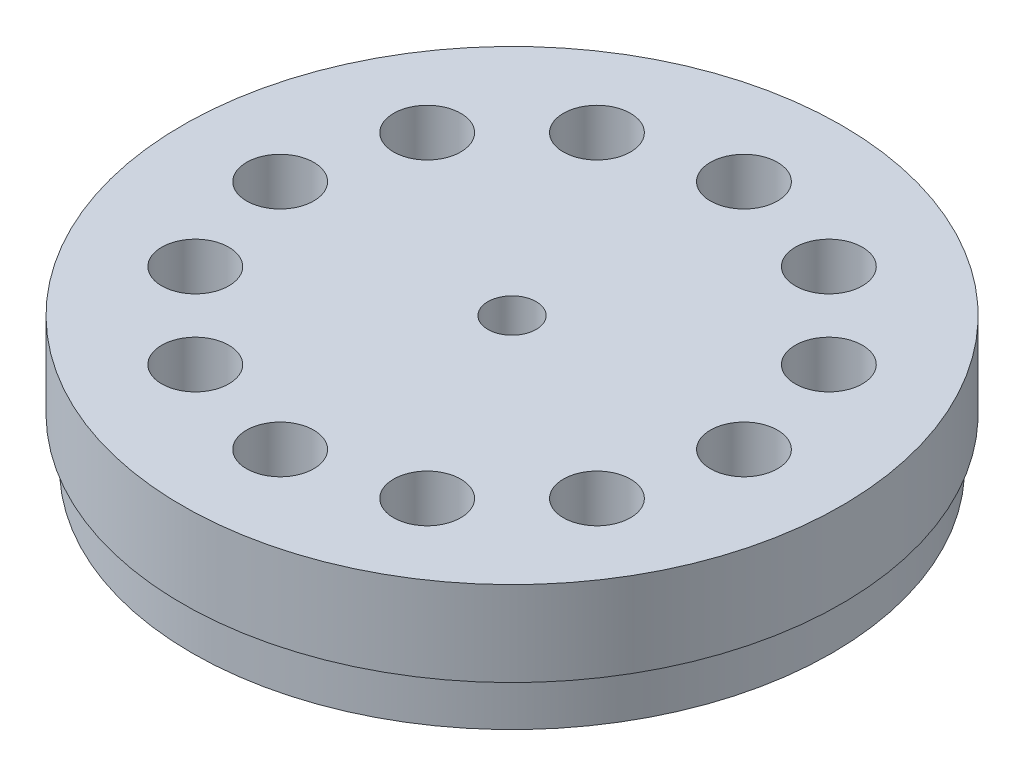
ISO-10303-21;
HEADER;
FILE_DESCRIPTION(('STEP AP214'),'2;1');
FILE_NAME('part.step','',(''),(''),'','','');
FILE_SCHEMA(('AUTOMOTIVE_DESIGN { 1 0 10303 214 1 1 1 1 }'));
ENDSEC;
DATA;
#1=APPLICATION_CONTEXT('core data for automotive mechanical design processes');
#2=APPLICATION_PROTOCOL_DEFINITION('international standard','automotive_design',2000,#1);
#3=PRODUCT_CONTEXT('',#1,'mechanical');
#4=PRODUCT('Part','Part','',(#3));
#5=PRODUCT_RELATED_PRODUCT_CATEGORY('part','',(#4));
#6=PRODUCT_DEFINITION_FORMATION('','',#4);
#7=PRODUCT_DEFINITION_CONTEXT('part definition',#1,'design');
#8=PRODUCT_DEFINITION('design','',#6,#7);
#9=PRODUCT_DEFINITION_SHAPE('','',#8);
#10=(LENGTH_UNIT() NAMED_UNIT(*) SI_UNIT(.MILLI.,.METRE.));
#11=(NAMED_UNIT(*) PLANE_ANGLE_UNIT() SI_UNIT($,.RADIAN.));
#12=(NAMED_UNIT(*) SI_UNIT($,.STERADIAN.) SOLID_ANGLE_UNIT());
#13=UNCERTAINTY_MEASURE_WITH_UNIT(LENGTH_MEASURE(1.E-05),#10,'distance_accuracy_value','');
#14=(GEOMETRIC_REPRESENTATION_CONTEXT(3) GLOBAL_UNCERTAINTY_ASSIGNED_CONTEXT((#13)) GLOBAL_UNIT_ASSIGNED_CONTEXT((#10,
#11,#12)) REPRESENTATION_CONTEXT('',''));
#15=CARTESIAN_POINT('',(0.,0.,0.));
#16=DIRECTION('',(0.,0.,1.));
#17=DIRECTION('',(1.,0.,0.));
#18=AXIS2_PLACEMENT_3D('',#15,#16,#17);
#19=CARTESIAN_POINT('',(0.,0.,0.));
#20=DIRECTION('',(0.,-1.,0.));
#21=DIRECTION('',(0.,0.,-1.));
#22=AXIS2_PLACEMENT_3D('',#19,#20,#21);
#23=PLANE('',#22);
#24=CARTESIAN_POINT('',(0.,0.,0.));
#25=DIRECTION('',(0.,-1.,0.));
#26=DIRECTION('',(0.,0.,-1.));
#27=AXIS2_PLACEMENT_3D('',#24,#25,#26);
#28=CIRCLE('',#27,2.24789999999999);
#29=CARTESIAN_POINT('',(0.,0.,-2.24789999999999));
#30=VERTEX_POINT('',#29);
#31=EDGE_CURVE('E224',#30,#30,#28,.T.);
#32=ORIENTED_EDGE('',*,*,#31,.T.);
#33=EDGE_LOOP('',(#32));
#34=FACE_BOUND('',#33,.T.);
#35=CARTESIAN_POINT('',(-10.7949999999998,0.,-18.6974884677062));
#36=DIRECTION('',(0.,1.,0.));
#37=DIRECTION('',(0.,0.,1.));
#38=AXIS2_PLACEMENT_3D('',#35,#36,#37);
#39=CIRCLE('',#38,3.1242);
#40=CARTESIAN_POINT('',(-10.7949999999998,0.,-15.5732884677062));
#41=VERTEX_POINT('',#40);
#42=EDGE_CURVE('E103',#41,#41,#39,.T.);
#43=ORIENTED_EDGE('',*,*,#42,.F.);
#44=EDGE_LOOP('',(#43));
#45=FACE_BOUND('',#44,.T.);
#46=CARTESIAN_POINT('',(-18.6974884677059,0.,-10.7950000000002));
#47=DIRECTION('',(0.,1.,0.));
#48=DIRECTION('',(0.,0.,1.));
#49=AXIS2_PLACEMENT_3D('',#46,#47,#48);
#50=CIRCLE('',#49,3.1242);
#51=CARTESIAN_POINT('',(-18.6974884677059,0.,-7.67080000000022));
#52=VERTEX_POINT('',#51);
#53=EDGE_CURVE('E93',#52,#52,#50,.T.);
#54=ORIENTED_EDGE('',*,*,#53,.F.);
#55=EDGE_LOOP('',(#54));
#56=FACE_BOUND('',#55,.T.);
#57=CARTESIAN_POINT('',(-21.59,0.,-2.26143377299055E-13));
#58=DIRECTION('',(0.,1.,0.));
#59=DIRECTION('',(0.,0.,1.));
#60=AXIS2_PLACEMENT_3D('',#57,#58,#59);
#61=CIRCLE('',#60,3.1242);
#62=CARTESIAN_POINT('',(-21.59,0.,3.12419999999977));
#63=VERTEX_POINT('',#62);
#64=EDGE_CURVE('E90',#63,#63,#61,.T.);
#65=ORIENTED_EDGE('',*,*,#64,.F.);
#66=EDGE_LOOP('',(#65));
#67=FACE_BOUND('',#66,.T.);
#68=CARTESIAN_POINT('',(-18.6974884677061,0.,10.7949999999998));
#69=DIRECTION('',(0.,1.,0.));
#70=DIRECTION('',(0.,0.,1.));
#71=AXIS2_PLACEMENT_3D('',#68,#69,#70);
#72=CIRCLE('',#71,3.1242);
#73=CARTESIAN_POINT('',(-18.6974884677061,0.,13.9191999999998));
#74=VERTEX_POINT('',#73);
#75=EDGE_CURVE('E87',#74,#74,#72,.T.);
#76=ORIENTED_EDGE('',*,*,#75,.F.);
#77=EDGE_LOOP('',(#76));
#78=FACE_BOUND('',#77,.T.);
#79=CARTESIAN_POINT('',(-10.7950000000002,0.,18.6974884677059));
#80=DIRECTION('',(0.,1.,0.));
#81=DIRECTION('',(0.,0.,1.));
#82=AXIS2_PLACEMENT_3D('',#79,#80,#81);
#83=CIRCLE('',#82,3.1242);
#84=CARTESIAN_POINT('',(-10.7950000000002,0.,21.8216884677059));
#85=VERTEX_POINT('',#84);
#86=EDGE_CURVE('E83',#85,#85,#83,.T.);
#87=ORIENTED_EDGE('',*,*,#86,.F.);
#88=EDGE_LOOP('',(#87));
#89=FACE_BOUND('',#88,.T.);
#90=CARTESIAN_POINT('',(-1.50762251532703E-13,0.,21.59));
#91=DIRECTION('',(0.,1.,0.));
#92=DIRECTION('',(0.,0.,1.));
#93=AXIS2_PLACEMENT_3D('',#90,#91,#92);
#94=CIRCLE('',#93,3.1242);
#95=CARTESIAN_POINT('',(-1.50762251532703E-13,0.,24.7142));
#96=VERTEX_POINT('',#95);
#97=EDGE_CURVE('E79',#96,#96,#94,.T.);
#98=ORIENTED_EDGE('',*,*,#97,.F.);
#99=EDGE_LOOP('',(#98));
#100=FACE_BOUND('',#99,.T.);
#101=CARTESIAN_POINT('',(10.7949999999999,0.,18.6974884677061));
#102=DIRECTION('',(0.,1.,0.));
#103=DIRECTION('',(0.,0.,1.));
#104=AXIS2_PLACEMENT_3D('',#101,#102,#103);
#105=CIRCLE('',#104,3.1242);
#106=CARTESIAN_POINT('',(10.7949999999999,0.,21.8216884677061));
#107=VERTEX_POINT('',#106);
#108=EDGE_CURVE('E75',#107,#107,#105,.T.);
#109=ORIENTED_EDGE('',*,*,#108,.F.);
#110=EDGE_LOOP('',(#109));
#111=FACE_BOUND('',#110,.T.);
#112=CARTESIAN_POINT('',(18.697488467706,0.,10.7950000000001));
#113=DIRECTION('',(0.,1.,0.));
#114=DIRECTION('',(0.,0.,1.));
#115=AXIS2_PLACEMENT_3D('',#112,#113,#114);
#116=CIRCLE('',#115,3.1242);
#117=CARTESIAN_POINT('',(18.697488467706,0.,13.9192000000001));
#118=VERTEX_POINT('',#117);
#119=EDGE_CURVE('E71',#118,#118,#116,.T.);
#120=ORIENTED_EDGE('',*,*,#119,.F.);
#121=EDGE_LOOP('',(#120));
#122=FACE_BOUND('',#121,.T.);
#123=CARTESIAN_POINT('',(21.59,0.,0.));
#124=DIRECTION('',(0.,1.,0.));
#125=DIRECTION('',(0.,0.,1.));
#126=AXIS2_PLACEMENT_3D('',#123,#124,#125);
#127=CIRCLE('',#126,3.1242);
#128=CARTESIAN_POINT('',(21.59,0.,3.12420000000007));
#129=VERTEX_POINT('',#128);
#130=EDGE_CURVE('E67',#129,#129,#127,.T.);
#131=ORIENTED_EDGE('',*,*,#130,.F.);
#132=EDGE_LOOP('',(#131));
#133=FACE_BOUND('',#132,.T.);
#134=CARTESIAN_POINT('',(18.6974884677061,0.,-10.795));
#135=DIRECTION('',(0.,1.,0.));
#136=DIRECTION('',(0.,0.,1.));
#137=AXIS2_PLACEMENT_3D('',#134,#135,#136);
#138=CIRCLE('',#137,3.1242);
#139=CARTESIAN_POINT('',(18.6974884677061,0.,-7.67079999999996));
#140=VERTEX_POINT('',#139);
#141=EDGE_CURVE('E63',#140,#140,#138,.T.);
#142=ORIENTED_EDGE('',*,*,#141,.F.);
#143=EDGE_LOOP('',(#142));
#144=FACE_BOUND('',#143,.T.);
#145=CARTESIAN_POINT('',(10.795,0.,-18.697488467706));
#146=DIRECTION('',(0.,1.,0.));
#147=DIRECTION('',(0.,0.,1.));
#148=AXIS2_PLACEMENT_3D('',#145,#146,#147);
#149=CIRCLE('',#148,3.1242);
#150=CARTESIAN_POINT('',(10.795,0.,-15.573288467706));
#151=VERTEX_POINT('',#150);
#152=EDGE_CURVE('E59',#151,#151,#149,.T.);
#153=ORIENTED_EDGE('',*,*,#152,.F.);
#154=EDGE_LOOP('',(#153));
#155=FACE_BOUND('',#154,.T.);
#156=CARTESIAN_POINT('',(0.,0.,-21.59));
#157=DIRECTION('',(0.,1.,0.));
#158=DIRECTION('',(0.,0.,1.));
#159=AXIS2_PLACEMENT_3D('',#156,#157,#158);
#160=CIRCLE('',#159,3.1242);
#161=CARTESIAN_POINT('',(0.,0.,-18.4658));
#162=VERTEX_POINT('',#161);
#163=EDGE_CURVE('E55',#162,#162,#160,.T.);
#164=ORIENTED_EDGE('',*,*,#163,.F.);
#165=EDGE_LOOP('',(#164));
#166=FACE_BOUND('',#165,.T.);
#167=CARTESIAN_POINT('',(0.,0.,0.));
#168=DIRECTION('',(0.,-1.,0.));
#169=DIRECTION('',(0.,0.,-1.));
#170=AXIS2_PLACEMENT_3D('',#167,#168,#169);
#171=CIRCLE('',#170,30.6832);
#172=CARTESIAN_POINT('',(0.,0.,-30.6832));
#173=VERTEX_POINT('',#172);
#174=EDGE_CURVE('E10',#173,#173,#171,.T.);
#175=ORIENTED_EDGE('',*,*,#174,.F.);
#176=EDGE_LOOP('',(#175));
#177=FACE_BOUND('',#176,.T.);
#178=ADVANCED_FACE('F35',(#34,#45,#56,#67,#78,#89,#100,#111,#122,#133,#144,#155,#166,#177),#23,.F.);
#179=CARTESIAN_POINT('',(0.,-6.223,0.));
#180=DIRECTION('',(0.,-1.,0.));
#181=DIRECTION('',(0.,0.,-1.));
#182=AXIS2_PLACEMENT_3D('',#179,#180,#181);
#183=CYLINDRICAL_SURFACE('',#182,30.6832);
#184=CARTESIAN_POINT('',(0.,-7.8994,0.));
#185=DIRECTION('',(0.,-1.,0.));
#186=DIRECTION('',(0.,0.,-1.));
#187=AXIS2_PLACEMENT_3D('',#184,#185,#186);
#188=CIRCLE('',#187,30.6832);
#189=CARTESIAN_POINT('',(0.,-7.8994,-30.6832));
#190=VERTEX_POINT('',#189);
#191=EDGE_CURVE('E42',#190,#190,#188,.T.);
#192=ORIENTED_EDGE('',*,*,#191,.F.);
#193=EDGE_LOOP('',(#192));
#194=FACE_BOUND('',#193,.T.);
#195=ORIENTED_EDGE('',*,*,#174,.T.);
#196=EDGE_LOOP('',(#195));
#197=FACE_BOUND('',#196,.T.);
#198=ADVANCED_FACE('F140',(#194,#197),#183,.T.);
#199=CARTESIAN_POINT('',(-30.6832,-7.8994,0.));
#200=DIRECTION('',(0.,1.,0.));
#201=DIRECTION('',(0.,0.,1.));
#202=AXIS2_PLACEMENT_3D('',#199,#200,#201);
#203=PLANE('',#202);
#204=CARTESIAN_POINT('',(0.,-7.8994,0.));
#205=DIRECTION('',(0.,-1.,0.));
#206=DIRECTION('',(0.,0.,-1.));
#207=AXIS2_PLACEMENT_3D('',#204,#205,#206);
#208=CIRCLE('',#207,29.7942);
#209=CARTESIAN_POINT('',(0.,-7.8994,-29.7942));
#210=VERTEX_POINT('',#209);
#211=EDGE_CURVE('E47',#210,#210,#208,.T.);
#212=ORIENTED_EDGE('',*,*,#211,.F.);
#213=EDGE_LOOP('',(#212));
#214=FACE_BOUND('',#213,.T.);
#215=ORIENTED_EDGE('',*,*,#191,.T.);
#216=EDGE_LOOP('',(#215));
#217=FACE_BOUND('',#216,.T.);
#218=ADVANCED_FACE('F137',(#214,#217),#203,.F.);
#219=CARTESIAN_POINT('',(0.,-6.223,0.));
#220=DIRECTION('',(0.,-1.,0.));
#221=DIRECTION('',(0.,0.,-1.));
#222=AXIS2_PLACEMENT_3D('',#219,#220,#221);
#223=CYLINDRICAL_SURFACE('',#222,29.7942);
#224=CARTESIAN_POINT('',(0.,-12.319,0.));
#225=DIRECTION('',(0.,-1.,0.));
#226=DIRECTION('',(0.,0.,-1.));
#227=AXIS2_PLACEMENT_3D('',#224,#225,#226);
#228=CIRCLE('',#227,29.7942);
#229=CARTESIAN_POINT('',(0.,-12.319,-29.7942));
#230=VERTEX_POINT('',#229);
#231=EDGE_CURVE('E130',#230,#230,#228,.T.);
#232=ORIENTED_EDGE('',*,*,#231,.F.);
#233=EDGE_LOOP('',(#232));
#234=FACE_BOUND('',#233,.T.);
#235=ORIENTED_EDGE('',*,*,#211,.T.);
#236=EDGE_LOOP('',(#235));
#237=FACE_BOUND('',#236,.T.);
#238=ADVANCED_FACE('F135',(#234,#237),#223,.T.);
#239=CARTESIAN_POINT('',(-29.7942,-12.319,0.));
#240=DIRECTION('',(0.,1.,0.));
#241=DIRECTION('',(0.,0.,1.));
#242=AXIS2_PLACEMENT_3D('',#239,#240,#241);
#243=PLANE('',#242);
#244=CARTESIAN_POINT('',(0.,-12.319,0.));
#245=DIRECTION('',(0.,-1.,0.));
#246=DIRECTION('',(0.,0.,-1.));
#247=AXIS2_PLACEMENT_3D('',#244,#245,#246);
#248=CIRCLE('',#247,26.1112);
#249=CARTESIAN_POINT('',(0.,-12.319,-26.1112));
#250=VERTEX_POINT('',#249);
#251=EDGE_CURVE('E127',#250,#250,#248,.T.);
#252=ORIENTED_EDGE('',*,*,#251,.F.);
#253=EDGE_LOOP('',(#252));
#254=FACE_BOUND('',#253,.T.);
#255=ORIENTED_EDGE('',*,*,#231,.T.);
#256=EDGE_LOOP('',(#255));
#257=FACE_BOUND('',#256,.T.);
#258=ADVANCED_FACE('F153',(#254,#257),#243,.F.);
#259=CARTESIAN_POINT('',(0.,-6.223,0.));
#260=DIRECTION('',(0.,-1.,0.));
#261=DIRECTION('',(0.,0.,-1.));
#262=AXIS2_PLACEMENT_3D('',#259,#260,#261);
#263=CYLINDRICAL_SURFACE('',#262,26.1112);
#264=CARTESIAN_POINT('',(0.,-6.223,0.));
#265=DIRECTION('',(0.,-1.,0.));
#266=DIRECTION('',(0.,0.,-1.));
#267=AXIS2_PLACEMENT_3D('',#264,#265,#266);
#268=CIRCLE('',#267,26.1112);
#269=CARTESIAN_POINT('',(0.,-6.223,-26.1112));
#270=VERTEX_POINT('',#269);
#271=EDGE_CURVE('E54',#270,#270,#268,.T.);
#272=ORIENTED_EDGE('',*,*,#271,.F.);
#273=EDGE_LOOP('',(#272));
#274=FACE_BOUND('',#273,.T.);
#275=ORIENTED_EDGE('',*,*,#251,.T.);
#276=EDGE_LOOP('',(#275));
#277=FACE_BOUND('',#276,.T.);
#278=ADVANCED_FACE('F157',(#274,#277),#263,.F.);
#279=CARTESIAN_POINT('',(-26.1112,-6.223,0.));
#280=DIRECTION('',(0.,1.,0.));
#281=DIRECTION('',(0.,0.,1.));
#282=AXIS2_PLACEMENT_3D('',#279,#280,#281);
#283=PLANE('',#282);
#284=CARTESIAN_POINT('',(0.,-6.223,0.));
#285=DIRECTION('',(0.,-1.,0.));
#286=DIRECTION('',(0.,0.,-1.));
#287=AXIS2_PLACEMENT_3D('',#284,#285,#286);
#288=CIRCLE('',#287,2.24789999999999);
#289=CARTESIAN_POINT('',(0.,-6.223,-2.24789999999999));
#290=VERTEX_POINT('',#289);
#291=EDGE_CURVE('E221',#290,#290,#288,.T.);
#292=ORIENTED_EDGE('',*,*,#291,.F.);
#293=EDGE_LOOP('',(#292));
#294=FACE_BOUND('',#293,.T.);
#295=CARTESIAN_POINT('',(-10.7949999999998,-6.223,-18.6974884677062));
#296=DIRECTION('',(0.,1.,0.));
#297=DIRECTION('',(0.,0.,1.));
#298=AXIS2_PLACEMENT_3D('',#295,#296,#297);
#299=CIRCLE('',#298,3.1242);
#300=CARTESIAN_POINT('',(-10.7949999999998,-6.223,-15.5732884677062));
#301=VERTEX_POINT('',#300);
#302=EDGE_CURVE('E38',#301,#301,#299,.T.);
#303=ORIENTED_EDGE('',*,*,#302,.T.);
#304=EDGE_LOOP('',(#303));
#305=FACE_BOUND('',#304,.T.);
#306=CARTESIAN_POINT('',(-18.6974884677059,-6.223,-10.7950000000002));
#307=DIRECTION('',(0.,1.,0.));
#308=DIRECTION('',(0.,0.,1.));
#309=AXIS2_PLACEMENT_3D('',#306,#307,#308);
#310=CIRCLE('',#309,3.1242);
#311=CARTESIAN_POINT('',(-18.6974884677059,-6.223,-7.67080000000022));
#312=VERTEX_POINT('',#311);
#313=EDGE_CURVE('E91',#312,#312,#310,.T.);
#314=ORIENTED_EDGE('',*,*,#313,.T.);
#315=EDGE_LOOP('',(#314));
#316=FACE_BOUND('',#315,.T.);
#317=CARTESIAN_POINT('',(-21.59,-6.223,-2.26143377299055E-13));
#318=DIRECTION('',(0.,1.,0.));
#319=DIRECTION('',(0.,0.,1.));
#320=AXIS2_PLACEMENT_3D('',#317,#318,#319);
#321=CIRCLE('',#320,3.1242);
#322=CARTESIAN_POINT('',(-21.59,-6.223,3.12419999999977));
#323=VERTEX_POINT('',#322);
#324=EDGE_CURVE('E88',#323,#323,#321,.T.);
#325=ORIENTED_EDGE('',*,*,#324,.T.);
#326=EDGE_LOOP('',(#325));
#327=FACE_BOUND('',#326,.T.);
#328=CARTESIAN_POINT('',(-18.6974884677061,-6.223,10.7949999999998));
#329=DIRECTION('',(0.,1.,0.));
#330=DIRECTION('',(0.,0.,1.));
#331=AXIS2_PLACEMENT_3D('',#328,#329,#330);
#332=CIRCLE('',#331,3.1242);
#333=CARTESIAN_POINT('',(-18.6974884677061,-6.223,13.9191999999998));
#334=VERTEX_POINT('',#333);
#335=EDGE_CURVE('E84',#334,#334,#332,.T.);
#336=ORIENTED_EDGE('',*,*,#335,.T.);
#337=EDGE_LOOP('',(#336));
#338=FACE_BOUND('',#337,.T.);
#339=CARTESIAN_POINT('',(-10.7950000000002,-6.223,18.6974884677059));
#340=DIRECTION('',(0.,1.,0.));
#341=DIRECTION('',(0.,0.,1.));
#342=AXIS2_PLACEMENT_3D('',#339,#340,#341);
#343=CIRCLE('',#342,3.1242);
#344=CARTESIAN_POINT('',(-10.7950000000002,-6.223,21.8216884677059));
#345=VERTEX_POINT('',#344);
#346=EDGE_CURVE('E80',#345,#345,#343,.T.);
#347=ORIENTED_EDGE('',*,*,#346,.T.);
#348=EDGE_LOOP('',(#347));
#349=FACE_BOUND('',#348,.T.);
#350=CARTESIAN_POINT('',(-1.50762251532703E-13,-6.223,21.59));
#351=DIRECTION('',(0.,1.,0.));
#352=DIRECTION('',(0.,0.,1.));
#353=AXIS2_PLACEMENT_3D('',#350,#351,#352);
#354=CIRCLE('',#353,3.1242);
#355=CARTESIAN_POINT('',(-1.50762251532703E-13,-6.223,24.7142));
#356=VERTEX_POINT('',#355);
#357=EDGE_CURVE('E76',#356,#356,#354,.T.);
#358=ORIENTED_EDGE('',*,*,#357,.T.);
#359=EDGE_LOOP('',(#358));
#360=FACE_BOUND('',#359,.T.);
#361=CARTESIAN_POINT('',(10.7949999999999,-6.223,18.6974884677061));
#362=DIRECTION('',(0.,1.,0.));
#363=DIRECTION('',(0.,0.,1.));
#364=AXIS2_PLACEMENT_3D('',#361,#362,#363);
#365=CIRCLE('',#364,3.1242);
#366=CARTESIAN_POINT('',(10.7949999999999,-6.223,21.8216884677061));
#367=VERTEX_POINT('',#366);
#368=EDGE_CURVE('E72',#367,#367,#365,.T.);
#369=ORIENTED_EDGE('',*,*,#368,.T.);
#370=EDGE_LOOP('',(#369));
#371=FACE_BOUND('',#370,.T.);
#372=CARTESIAN_POINT('',(18.697488467706,-6.223,10.7950000000001));
#373=DIRECTION('',(0.,1.,0.));
#374=DIRECTION('',(0.,0.,1.));
#375=AXIS2_PLACEMENT_3D('',#372,#373,#374);
#376=CIRCLE('',#375,3.1242);
#377=CARTESIAN_POINT('',(18.697488467706,-6.223,13.9192000000001));
#378=VERTEX_POINT('',#377);
#379=EDGE_CURVE('E68',#378,#378,#376,.T.);
#380=ORIENTED_EDGE('',*,*,#379,.T.);
#381=EDGE_LOOP('',(#380));
#382=FACE_BOUND('',#381,.T.);
#383=CARTESIAN_POINT('',(21.59,-6.223,0.));
#384=DIRECTION('',(0.,1.,0.));
#385=DIRECTION('',(0.,0.,1.));
#386=AXIS2_PLACEMENT_3D('',#383,#384,#385);
#387=CIRCLE('',#386,3.1242);
#388=CARTESIAN_POINT('',(21.59,-6.223,3.12420000000007));
#389=VERTEX_POINT('',#388);
#390=EDGE_CURVE('E64',#389,#389,#387,.T.);
#391=ORIENTED_EDGE('',*,*,#390,.T.);
#392=EDGE_LOOP('',(#391));
#393=FACE_BOUND('',#392,.T.);
#394=CARTESIAN_POINT('',(18.6974884677061,-6.223,-10.795));
#395=DIRECTION('',(0.,1.,0.));
#396=DIRECTION('',(0.,0.,1.));
#397=AXIS2_PLACEMENT_3D('',#394,#395,#396);
#398=CIRCLE('',#397,3.1242);
#399=CARTESIAN_POINT('',(18.6974884677061,-6.223,-7.67079999999996));
#400=VERTEX_POINT('',#399);
#401=EDGE_CURVE('E60',#400,#400,#398,.T.);
#402=ORIENTED_EDGE('',*,*,#401,.T.);
#403=EDGE_LOOP('',(#402));
#404=FACE_BOUND('',#403,.T.);
#405=CARTESIAN_POINT('',(10.795,-6.223,-18.697488467706));
#406=DIRECTION('',(0.,1.,0.));
#407=DIRECTION('',(0.,0.,1.));
#408=AXIS2_PLACEMENT_3D('',#405,#406,#407);
#409=CIRCLE('',#408,3.1242);
#410=CARTESIAN_POINT('',(10.795,-6.223,-15.573288467706));
#411=VERTEX_POINT('',#410);
#412=EDGE_CURVE('E56',#411,#411,#409,.T.);
#413=ORIENTED_EDGE('',*,*,#412,.T.);
#414=EDGE_LOOP('',(#413));
#415=FACE_BOUND('',#414,.T.);
#416=CARTESIAN_POINT('',(0.,-6.223,-21.59));
#417=DIRECTION('',(0.,1.,0.));
#418=DIRECTION('',(0.,0.,1.));
#419=AXIS2_PLACEMENT_3D('',#416,#417,#418);
#420=CIRCLE('',#419,3.1242);
#421=CARTESIAN_POINT('',(0.,-6.223,-18.4658));
#422=VERTEX_POINT('',#421);
#423=EDGE_CURVE('E51',#422,#422,#420,.T.);
#424=ORIENTED_EDGE('',*,*,#423,.T.);
#425=EDGE_LOOP('',(#424));
#426=FACE_BOUND('',#425,.T.);
#427=ORIENTED_EDGE('',*,*,#271,.T.);
#428=EDGE_LOOP('',(#427));
#429=FACE_BOUND('',#428,.T.);
#430=ADVANCED_FACE('F161',(#294,#305,#316,#327,#338,#349,#360,#371,#382,#393,#404,#415,#426,
#429),#283,.F.);
#431=CARTESIAN_POINT('',(0.,0.,-21.59));
#432=DIRECTION('',(0.,1.,0.));
#433=DIRECTION('',(0.,0.,1.));
#434=AXIS2_PLACEMENT_3D('',#431,#432,#433);
#435=CYLINDRICAL_SURFACE('',#434,3.1242);
#436=ORIENTED_EDGE('',*,*,#163,.T.);
#437=EDGE_LOOP('',(#436));
#438=FACE_BOUND('',#437,.T.);
#439=ORIENTED_EDGE('',*,*,#423,.F.);
#440=EDGE_LOOP('',(#439));
#441=FACE_BOUND('',#440,.T.);
#442=ADVANCED_FACE('F165',(#438,#441),#435,.F.);
#443=CARTESIAN_POINT('',(10.795,0.,-18.697488467706));
#444=DIRECTION('',(0.,1.,0.));
#445=DIRECTION('',(0.,0.,1.));
#446=AXIS2_PLACEMENT_3D('',#443,#444,#445);
#447=CYLINDRICAL_SURFACE('',#446,3.1242);
#448=ORIENTED_EDGE('',*,*,#152,.T.);
#449=EDGE_LOOP('',(#448));
#450=FACE_BOUND('',#449,.T.);
#451=ORIENTED_EDGE('',*,*,#412,.F.);
#452=EDGE_LOOP('',(#451));
#453=FACE_BOUND('',#452,.T.);
#454=ADVANCED_FACE('F169',(#450,#453),#447,.F.);
#455=CARTESIAN_POINT('',(18.6974884677061,0.,-10.795));
#456=DIRECTION('',(0.,1.,0.));
#457=DIRECTION('',(0.,0.,1.));
#458=AXIS2_PLACEMENT_3D('',#455,#456,#457);
#459=CYLINDRICAL_SURFACE('',#458,3.1242);
#460=ORIENTED_EDGE('',*,*,#141,.T.);
#461=EDGE_LOOP('',(#460));
#462=FACE_BOUND('',#461,.T.);
#463=ORIENTED_EDGE('',*,*,#401,.F.);
#464=EDGE_LOOP('',(#463));
#465=FACE_BOUND('',#464,.T.);
#466=ADVANCED_FACE('F173',(#462,#465),#459,.F.);
#467=CARTESIAN_POINT('',(21.59,0.,0.));
#468=DIRECTION('',(0.,1.,0.));
#469=DIRECTION('',(0.,0.,1.));
#470=AXIS2_PLACEMENT_3D('',#467,#468,#469);
#471=CYLINDRICAL_SURFACE('',#470,3.1242);
#472=ORIENTED_EDGE('',*,*,#130,.T.);
#473=EDGE_LOOP('',(#472));
#474=FACE_BOUND('',#473,.T.);
#475=ORIENTED_EDGE('',*,*,#390,.F.);
#476=EDGE_LOOP('',(#475));
#477=FACE_BOUND('',#476,.T.);
#478=ADVANCED_FACE('F177',(#474,#477),#471,.F.);
#479=CARTESIAN_POINT('',(18.697488467706,0.,10.7950000000001));
#480=DIRECTION('',(0.,1.,0.));
#481=DIRECTION('',(0.,0.,1.));
#482=AXIS2_PLACEMENT_3D('',#479,#480,#481);
#483=CYLINDRICAL_SURFACE('',#482,3.1242);
#484=ORIENTED_EDGE('',*,*,#119,.T.);
#485=EDGE_LOOP('',(#484));
#486=FACE_BOUND('',#485,.T.);
#487=ORIENTED_EDGE('',*,*,#379,.F.);
#488=EDGE_LOOP('',(#487));
#489=FACE_BOUND('',#488,.T.);
#490=ADVANCED_FACE('F181',(#486,#489),#483,.F.);
#491=CARTESIAN_POINT('',(10.7949999999999,0.,18.6974884677061));
#492=DIRECTION('',(0.,1.,0.));
#493=DIRECTION('',(0.,0.,1.));
#494=AXIS2_PLACEMENT_3D('',#491,#492,#493);
#495=CYLINDRICAL_SURFACE('',#494,3.1242);
#496=ORIENTED_EDGE('',*,*,#108,.T.);
#497=EDGE_LOOP('',(#496));
#498=FACE_BOUND('',#497,.T.);
#499=ORIENTED_EDGE('',*,*,#368,.F.);
#500=EDGE_LOOP('',(#499));
#501=FACE_BOUND('',#500,.T.);
#502=ADVANCED_FACE('F185',(#498,#501),#495,.F.);
#503=CARTESIAN_POINT('',(-1.50762251532703E-13,0.,21.59));
#504=DIRECTION('',(0.,1.,0.));
#505=DIRECTION('',(0.,0.,1.));
#506=AXIS2_PLACEMENT_3D('',#503,#504,#505);
#507=CYLINDRICAL_SURFACE('',#506,3.1242);
#508=ORIENTED_EDGE('',*,*,#97,.T.);
#509=EDGE_LOOP('',(#508));
#510=FACE_BOUND('',#509,.T.);
#511=ORIENTED_EDGE('',*,*,#357,.F.);
#512=EDGE_LOOP('',(#511));
#513=FACE_BOUND('',#512,.T.);
#514=ADVANCED_FACE('F189',(#510,#513),#507,.F.);
#515=CARTESIAN_POINT('',(-10.7950000000002,0.,18.6974884677059));
#516=DIRECTION('',(0.,1.,0.));
#517=DIRECTION('',(0.,0.,1.));
#518=AXIS2_PLACEMENT_3D('',#515,#516,#517);
#519=CYLINDRICAL_SURFACE('',#518,3.1242);
#520=ORIENTED_EDGE('',*,*,#86,.T.);
#521=EDGE_LOOP('',(#520));
#522=FACE_BOUND('',#521,.T.);
#523=ORIENTED_EDGE('',*,*,#346,.F.);
#524=EDGE_LOOP('',(#523));
#525=FACE_BOUND('',#524,.T.);
#526=ADVANCED_FACE('F193',(#522,#525),#519,.F.);
#527=CARTESIAN_POINT('',(-18.6974884677061,0.,10.7949999999998));
#528=DIRECTION('',(0.,1.,0.));
#529=DIRECTION('',(0.,0.,1.));
#530=AXIS2_PLACEMENT_3D('',#527,#528,#529);
#531=CYLINDRICAL_SURFACE('',#530,3.1242);
#532=ORIENTED_EDGE('',*,*,#75,.T.);
#533=EDGE_LOOP('',(#532));
#534=FACE_BOUND('',#533,.T.);
#535=ORIENTED_EDGE('',*,*,#335,.F.);
#536=EDGE_LOOP('',(#535));
#537=FACE_BOUND('',#536,.T.);
#538=ADVANCED_FACE('F197',(#534,#537),#531,.F.);
#539=CARTESIAN_POINT('',(-21.59,0.,-2.26143377299055E-13));
#540=DIRECTION('',(0.,1.,0.));
#541=DIRECTION('',(0.,0.,1.));
#542=AXIS2_PLACEMENT_3D('',#539,#540,#541);
#543=CYLINDRICAL_SURFACE('',#542,3.1242);
#544=ORIENTED_EDGE('',*,*,#64,.T.);
#545=EDGE_LOOP('',(#544));
#546=FACE_BOUND('',#545,.T.);
#547=ORIENTED_EDGE('',*,*,#324,.F.);
#548=EDGE_LOOP('',(#547));
#549=FACE_BOUND('',#548,.T.);
#550=ADVANCED_FACE('F201',(#546,#549),#543,.F.);
#551=CARTESIAN_POINT('',(-18.6974884677059,0.,-10.7950000000002));
#552=DIRECTION('',(0.,1.,0.));
#553=DIRECTION('',(0.,0.,1.));
#554=AXIS2_PLACEMENT_3D('',#551,#552,#553);
#555=CYLINDRICAL_SURFACE('',#554,3.1242);
#556=ORIENTED_EDGE('',*,*,#53,.T.);
#557=EDGE_LOOP('',(#556));
#558=FACE_BOUND('',#557,.T.);
#559=ORIENTED_EDGE('',*,*,#313,.F.);
#560=EDGE_LOOP('',(#559));
#561=FACE_BOUND('',#560,.T.);
#562=ADVANCED_FACE('F205',(#558,#561),#555,.F.);
#563=CARTESIAN_POINT('',(-10.7949999999998,0.,-18.6974884677062));
#564=DIRECTION('',(0.,1.,0.));
#565=DIRECTION('',(0.,0.,1.));
#566=AXIS2_PLACEMENT_3D('',#563,#564,#565);
#567=CYLINDRICAL_SURFACE('',#566,3.1242);
#568=ORIENTED_EDGE('',*,*,#42,.T.);
#569=EDGE_LOOP('',(#568));
#570=FACE_BOUND('',#569,.T.);
#571=ORIENTED_EDGE('',*,*,#302,.F.);
#572=EDGE_LOOP('',(#571));
#573=FACE_BOUND('',#572,.T.);
#574=ADVANCED_FACE('F209',(#570,#573),#567,.F.);
#575=CARTESIAN_POINT('',(0.,-6.223,0.));
#576=DIRECTION('',(0.,-1.,0.));
#577=DIRECTION('',(0.,0.,-1.));
#578=AXIS2_PLACEMENT_3D('',#575,#576,#577);
#579=CYLINDRICAL_SURFACE('',#578,2.24789999999999);
#580=ORIENTED_EDGE('',*,*,#291,.T.);
#581=EDGE_LOOP('',(#580));
#582=FACE_BOUND('',#581,.T.);
#583=ORIENTED_EDGE('',*,*,#31,.F.);
#584=EDGE_LOOP('',(#583));
#585=FACE_BOUND('',#584,.T.);
#586=ADVANCED_FACE('F212',(#582,#585),#579,.F.);
#587=CLOSED_SHELL('',(#178,#198,#218,#238,#258,#278,#430,#442,#454,#466,#478,#490,#502,#514,
#526,#538,#550,#562,#574,#586));
#588=MANIFOLD_SOLID_BREP('B2',#587);
#589=ADVANCED_BREP_SHAPE_REPRESENTATION('',(#18,#588),#14);
#590=SHAPE_DEFINITION_REPRESENTATION(#9,#589);
ENDSEC;
END-ISO-10303-21;
